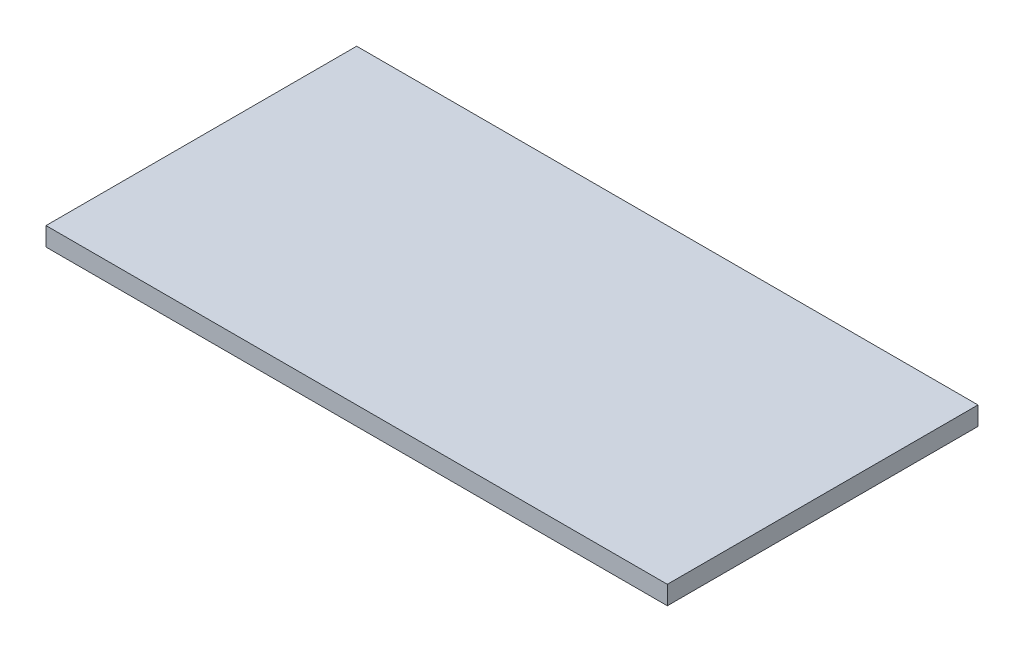
ISO-10303-21;
HEADER;
FILE_DESCRIPTION(('STEP AP214'),'2;1');
FILE_NAME('part.step','',(''),(''),'','','');
FILE_SCHEMA(('AUTOMOTIVE_DESIGN { 1 0 10303 214 1 1 1 1 }'));
ENDSEC;
DATA;
#1=APPLICATION_CONTEXT('core data for automotive mechanical design processes');
#2=APPLICATION_PROTOCOL_DEFINITION('international standard','automotive_design',2000,#1);
#3=PRODUCT_CONTEXT('',#1,'mechanical');
#4=PRODUCT('Part','Part','',(#3));
#5=PRODUCT_RELATED_PRODUCT_CATEGORY('part','',(#4));
#6=PRODUCT_DEFINITION_FORMATION('','',#4);
#7=PRODUCT_DEFINITION_CONTEXT('part definition',#1,'design');
#8=PRODUCT_DEFINITION('design','',#6,#7);
#9=PRODUCT_DEFINITION_SHAPE('','',#8);
#10=(LENGTH_UNIT() NAMED_UNIT(*) SI_UNIT(.MILLI.,.METRE.));
#11=(NAMED_UNIT(*) PLANE_ANGLE_UNIT() SI_UNIT($,.RADIAN.));
#12=(NAMED_UNIT(*) SI_UNIT($,.STERADIAN.) SOLID_ANGLE_UNIT());
#13=UNCERTAINTY_MEASURE_WITH_UNIT(LENGTH_MEASURE(1.E-05),#10,'distance_accuracy_value','');
#14=(GEOMETRIC_REPRESENTATION_CONTEXT(3) GLOBAL_UNCERTAINTY_ASSIGNED_CONTEXT((#13)) GLOBAL_UNIT_ASSIGNED_CONTEXT((#10,
#11,#12)) REPRESENTATION_CONTEXT('',''));
#15=CARTESIAN_POINT('',(0.,0.,0.));
#16=DIRECTION('',(0.,0.,1.));
#17=DIRECTION('',(1.,0.,0.));
#18=AXIS2_PLACEMENT_3D('',#15,#16,#17);
#19=CARTESIAN_POINT('',(50.,3.,-25.));
#20=DIRECTION('',(-1.,0.,0.));
#21=DIRECTION('',(0.,0.,1.));
#22=AXIS2_PLACEMENT_3D('',#19,#20,#21);
#23=PLANE('',#22);
#24=DIRECTION('',(0.,0.,-1.));
#25=VECTOR('',#24,1.);
#26=CARTESIAN_POINT('',(50.,0.,-25.));
#27=LINE('',#26,#25);
#28=CARTESIAN_POINT('',(50.,0.,25.));
#29=VERTEX_POINT('',#28);
#30=CARTESIAN_POINT('',(50.,0.,-25.));
#31=VERTEX_POINT('',#30);
#32=EDGE_CURVE('E98',#29,#31,#27,.T.);
#33=ORIENTED_EDGE('',*,*,#32,.T.);
#34=DIRECTION('',(0.,-1.,0.));
#35=VECTOR('',#34,1.);
#36=CARTESIAN_POINT('',(50.,3.,-25.));
#37=LINE('',#36,#35);
#38=CARTESIAN_POINT('',(50.,3.,-25.));
#39=VERTEX_POINT('',#38);
#40=EDGE_CURVE('E11',#39,#31,#37,.T.);
#41=ORIENTED_EDGE('',*,*,#40,.F.);
#42=DIRECTION('',(0.,0.,-1.));
#43=VECTOR('',#42,1.);
#44=CARTESIAN_POINT('',(50.,3.,-25.));
#45=LINE('',#44,#43);
#46=CARTESIAN_POINT('',(50.,3.,25.));
#47=VERTEX_POINT('',#46);
#48=EDGE_CURVE('E86',#47,#39,#45,.T.);
#49=ORIENTED_EDGE('',*,*,#48,.F.);
#50=DIRECTION('',(0.,-1.,0.));
#51=VECTOR('',#50,1.);
#52=CARTESIAN_POINT('',(50.,3.,25.));
#53=LINE('',#52,#51);
#54=EDGE_CURVE('E94',#47,#29,#53,.T.);
#55=ORIENTED_EDGE('',*,*,#54,.T.);
#56=EDGE_LOOP('',(#33,#41,#49,#55));
#57=FACE_BOUND('',#56,.T.);
#58=ADVANCED_FACE('F35',(#57),#23,.F.);
#59=CARTESIAN_POINT('',(-50.,3.,-25.));
#60=DIRECTION('',(0.,0.,1.));
#61=DIRECTION('',(1.,0.,0.));
#62=AXIS2_PLACEMENT_3D('',#59,#60,#61);
#63=PLANE('',#62);
#64=DIRECTION('',(-1.,0.,0.));
#65=VECTOR('',#64,1.);
#66=CARTESIAN_POINT('',(-50.,0.,-25.));
#67=LINE('',#66,#65);
#68=CARTESIAN_POINT('',(-50.,0.,-25.));
#69=VERTEX_POINT('',#68);
#70=EDGE_CURVE('E90',#31,#69,#67,.T.);
#71=ORIENTED_EDGE('',*,*,#70,.T.);
#72=DIRECTION('',(0.,-1.,0.));
#73=VECTOR('',#72,1.);
#74=CARTESIAN_POINT('',(-50.,3.,-25.));
#75=LINE('',#74,#73);
#76=CARTESIAN_POINT('',(-50.,3.,-25.));
#77=VERTEX_POINT('',#76);
#78=EDGE_CURVE('E43',#77,#69,#75,.T.);
#79=ORIENTED_EDGE('',*,*,#78,.F.);
#80=DIRECTION('',(-1.,0.,0.));
#81=VECTOR('',#80,1.);
#82=CARTESIAN_POINT('',(-50.,3.,-25.));
#83=LINE('',#82,#81);
#84=EDGE_CURVE('E81',#39,#77,#83,.T.);
#85=ORIENTED_EDGE('',*,*,#84,.F.);
#86=ORIENTED_EDGE('',*,*,#40,.T.);
#87=EDGE_LOOP('',(#71,#79,#85,#86));
#88=FACE_BOUND('',#87,.T.);
#89=ADVANCED_FACE('F89',(#88),#63,.F.);
#90=CARTESIAN_POINT('',(-50.,3.,-25.));
#91=DIRECTION('',(1.,0.,0.));
#92=DIRECTION('',(0.,0.,-1.));
#93=AXIS2_PLACEMENT_3D('',#90,#91,#92);
#94=PLANE('',#93);
#95=DIRECTION('',(0.,0.,1.));
#96=VECTOR('',#95,1.);
#97=CARTESIAN_POINT('',(-50.,0.,-25.));
#98=LINE('',#97,#96);
#99=CARTESIAN_POINT('',(-50.,0.,25.));
#100=VERTEX_POINT('',#99);
#101=EDGE_CURVE('E68',#69,#100,#98,.T.);
#102=ORIENTED_EDGE('',*,*,#101,.T.);
#103=DIRECTION('',(0.,-1.,0.));
#104=VECTOR('',#103,1.);
#105=CARTESIAN_POINT('',(-50.,3.,25.));
#106=LINE('',#105,#104);
#107=CARTESIAN_POINT('',(-50.,3.,25.));
#108=VERTEX_POINT('',#107);
#109=EDGE_CURVE('E91',#108,#100,#106,.T.);
#110=ORIENTED_EDGE('',*,*,#109,.F.);
#111=DIRECTION('',(0.,0.,1.));
#112=VECTOR('',#111,1.);
#113=CARTESIAN_POINT('',(-50.,3.,-25.));
#114=LINE('',#113,#112);
#115=EDGE_CURVE('E84',#77,#108,#114,.T.);
#116=ORIENTED_EDGE('',*,*,#115,.F.);
#117=ORIENTED_EDGE('',*,*,#78,.T.);
#118=EDGE_LOOP('',(#102,#110,#116,#117));
#119=FACE_BOUND('',#118,.T.);
#120=ADVANCED_FACE('F92',(#119),#94,.F.);
#121=CARTESIAN_POINT('',(-50.,3.,25.));
#122=DIRECTION('',(0.,0.,-1.));
#123=DIRECTION('',(-1.,0.,0.));
#124=AXIS2_PLACEMENT_3D('',#121,#122,#123);
#125=PLANE('',#124);
#126=DIRECTION('',(1.,0.,0.));
#127=VECTOR('',#126,1.);
#128=CARTESIAN_POINT('',(-50.,0.,25.));
#129=LINE('',#128,#127);
#130=EDGE_CURVE('E74',#100,#29,#129,.T.);
#131=ORIENTED_EDGE('',*,*,#130,.T.);
#132=ORIENTED_EDGE('',*,*,#54,.F.);
#133=DIRECTION('',(1.,0.,0.));
#134=VECTOR('',#133,1.);
#135=CARTESIAN_POINT('',(-50.,3.,25.));
#136=LINE('',#135,#134);
#137=EDGE_CURVE('E51',#108,#47,#136,.T.);
#138=ORIENTED_EDGE('',*,*,#137,.F.);
#139=ORIENTED_EDGE('',*,*,#109,.T.);
#140=EDGE_LOOP('',(#131,#132,#138,#139));
#141=FACE_BOUND('',#140,.T.);
#142=ADVANCED_FACE('F105',(#141),#125,.F.);
#143=CARTESIAN_POINT('',(0.,3.,0.));
#144=DIRECTION('',(0.,1.,0.));
#145=DIRECTION('',(0.,0.,1.));
#146=AXIS2_PLACEMENT_3D('',#143,#144,#145);
#147=PLANE('',#146);
#148=ORIENTED_EDGE('',*,*,#48,.T.);
#149=ORIENTED_EDGE('',*,*,#84,.T.);
#150=ORIENTED_EDGE('',*,*,#115,.T.);
#151=ORIENTED_EDGE('',*,*,#137,.T.);
#152=EDGE_LOOP('',(#148,#149,#150,#151));
#153=FACE_BOUND('',#152,.T.);
#154=ADVANCED_FACE('F82',(#153),#147,.T.);
#155=CARTESIAN_POINT('',(0.,0.,0.));
#156=DIRECTION('',(0.,1.,0.));
#157=DIRECTION('',(0.,0.,1.));
#158=AXIS2_PLACEMENT_3D('',#155,#156,#157);
#159=PLANE('',#158);
#160=ORIENTED_EDGE('',*,*,#32,.F.);
#161=ORIENTED_EDGE('',*,*,#130,.F.);
#162=ORIENTED_EDGE('',*,*,#101,.F.);
#163=ORIENTED_EDGE('',*,*,#70,.F.);
#164=EDGE_LOOP('',(#160,#161,#162,#163));
#165=FACE_BOUND('',#164,.T.);
#166=ADVANCED_FACE('F108',(#165),#159,.F.);
#167=CLOSED_SHELL('',(#58,#89,#120,#142,#154,#166));
#168=MANIFOLD_SOLID_BREP('B2',#167);
#169=ADVANCED_BREP_SHAPE_REPRESENTATION('',(#18,#168),#14);
#170=SHAPE_DEFINITION_REPRESENTATION(#9,#169);
ENDSEC;
END-ISO-10303-21;
